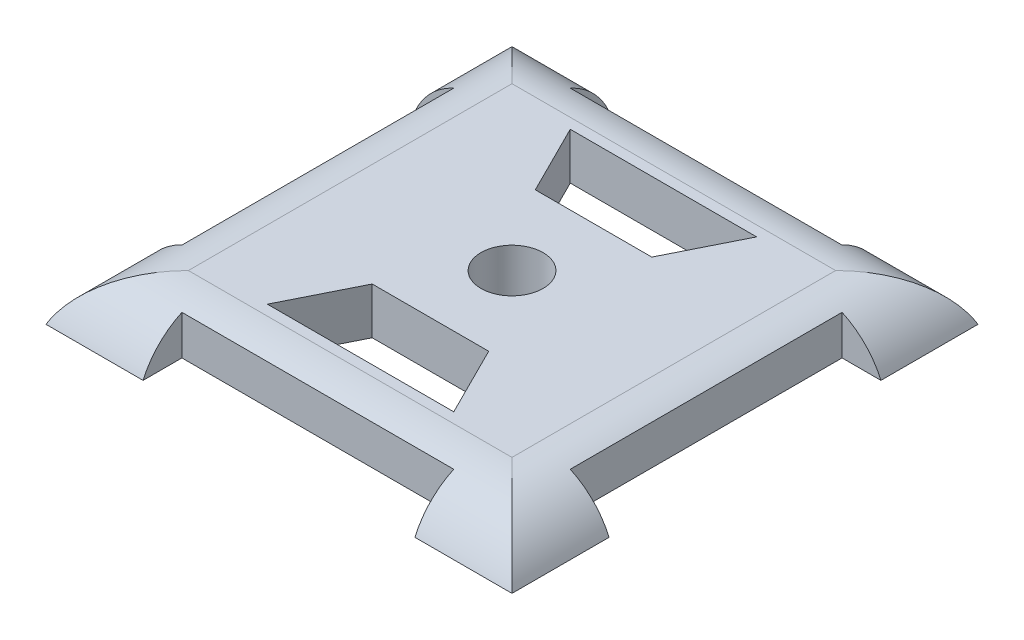
ISO-10303-21;
HEADER;
FILE_DESCRIPTION(('STEP AP214'),'2;1');
FILE_NAME('part.step','',(''),(''),'','','');
FILE_SCHEMA(('AUTOMOTIVE_DESIGN { 1 0 10303 214 1 1 1 1 }'));
ENDSEC;
DATA;
#1=APPLICATION_CONTEXT('core data for automotive mechanical design processes');
#2=APPLICATION_PROTOCOL_DEFINITION('international standard','automotive_design',2000,#1);
#3=PRODUCT_CONTEXT('',#1,'mechanical');
#4=PRODUCT('Part','Part','',(#3));
#5=PRODUCT_RELATED_PRODUCT_CATEGORY('part','',(#4));
#6=PRODUCT_DEFINITION_FORMATION('','',#4);
#7=PRODUCT_DEFINITION_CONTEXT('part definition',#1,'design');
#8=PRODUCT_DEFINITION('design','',#6,#7);
#9=PRODUCT_DEFINITION_SHAPE('','',#8);
#10=(LENGTH_UNIT() NAMED_UNIT(*) SI_UNIT(.MILLI.,.METRE.));
#11=(NAMED_UNIT(*) PLANE_ANGLE_UNIT() SI_UNIT($,.RADIAN.));
#12=(NAMED_UNIT(*) SI_UNIT($,.STERADIAN.) SOLID_ANGLE_UNIT());
#13=UNCERTAINTY_MEASURE_WITH_UNIT(LENGTH_MEASURE(1.E-05),#10,'distance_accuracy_value','');
#14=(GEOMETRIC_REPRESENTATION_CONTEXT(3) GLOBAL_UNCERTAINTY_ASSIGNED_CONTEXT((#13)) GLOBAL_UNIT_ASSIGNED_CONTEXT((#10,
#11,#12)) REPRESENTATION_CONTEXT('',''));
#15=CARTESIAN_POINT('',(0.,0.,0.));
#16=DIRECTION('',(0.,0.,1.));
#17=DIRECTION('',(1.,0.,0.));
#18=AXIS2_PLACEMENT_3D('',#15,#16,#17);
#19=CARTESIAN_POINT('',(-0.132653061224493,1.6,-1.19387755102041));
#20=DIRECTION('',(0.,1.,0.));
#21=DIRECTION('',(0.,0.,1.));
#22=AXIS2_PLACEMENT_3D('',#19,#20,#21);
#23=PLANE('',#22);
#24=CARTESIAN_POINT('',(-0.331632653061232,1.6,-2.98469387755102));
#25=DIRECTION('',(0.,-1.,0.));
#26=DIRECTION('',(0.,0.,-1.));
#27=AXIS2_PLACEMENT_3D('',#24,#25,#26);
#28=CIRCLE('',#27,0.8);
#29=CARTESIAN_POINT('',(-0.331632653061232,1.6,-3.78469387755102));
#30=VERTEX_POINT('',#29);
#31=EDGE_CURVE('E450',#30,#30,#28,.T.);
#32=ORIENTED_EDGE('',*,*,#31,.T.);
#33=EDGE_LOOP('',(#32));
#34=FACE_BOUND('',#33,.T.);
#35=DIRECTION('',(-1.,0.,0.));
#36=VECTOR('',#35,1.);
#37=CARTESIAN_POINT('',(5.66836734693877,1.6,1.18227584446664));
#38=LINE('',#37,#36);
#39=CARTESIAN_POINT('',(-4.4986023750789,1.6,1.18227584446664));
#40=VERTEX_POINT('',#39);
#41=CARTESIAN_POINT('',(3.83533706895643,1.6,1.18227584446664));
#42=VERTEX_POINT('',#41);
#43=EDGE_CURVE('E411',#40,#42,#38,.F.);
#44=ORIENTED_EDGE('',*,*,#43,.T.);
#45=DIRECTION('',(0.,0.,1.));
#46=VECTOR('',#45,1.);
#47=CARTESIAN_POINT('',(3.83533706895643,1.6,-8.98469387755102));
#48=LINE('',#47,#46);
#49=CARTESIAN_POINT('',(3.83533706895643,1.6,-7.15166359956868));
#50=VERTEX_POINT('',#49);
#51=EDGE_CURVE('E414',#42,#50,#48,.F.);
#52=ORIENTED_EDGE('',*,*,#51,.T.);
#53=DIRECTION('',(1.,0.,0.));
#54=VECTOR('',#53,1.);
#55=CARTESIAN_POINT('',(-6.33163265306123,1.6,-7.15166359956868));
#56=LINE('',#55,#54);
#57=CARTESIAN_POINT('',(-4.4986023750789,1.6,-7.15166359956868));
#58=VERTEX_POINT('',#57);
#59=EDGE_CURVE('E405',#50,#58,#56,.F.);
#60=ORIENTED_EDGE('',*,*,#59,.T.);
#61=DIRECTION('',(0.,0.,-1.));
#62=VECTOR('',#61,1.);
#63=CARTESIAN_POINT('',(-4.4986023750789,1.6,3.01530612244898));
#64=LINE('',#63,#62);
#65=EDGE_CURVE('E408',#58,#40,#64,.F.);
#66=ORIENTED_EDGE('',*,*,#65,.T.);
#67=EDGE_LOOP('',(#44,#52,#60,#66));
#68=FACE_BOUND('',#67,.T.);
#69=DIRECTION('',(0.447213595499958,0.,0.894427190999916));
#70=VECTOR('',#69,1.);
#71=CARTESIAN_POINT('',(-2.73163265306123,1.6,-6.88469387755102));
#72=LINE('',#71,#70);
#73=CARTESIAN_POINT('',(-2.73163265306123,1.6,-6.88469387755102));
#74=VERTEX_POINT('',#73);
#75=CARTESIAN_POINT('',(-1.83163265306123,1.6,-5.08469387755102));
#76=VERTEX_POINT('',#75);
#77=EDGE_CURVE('E325',#74,#76,#72,.T.);
#78=ORIENTED_EDGE('',*,*,#77,.F.);
#79=DIRECTION('',(-1.,0.,0.));
#80=VECTOR('',#79,1.);
#81=CARTESIAN_POINT('',(-2.73163265306123,1.6,-6.88469387755102));
#82=LINE('',#81,#80);
#83=CARTESIAN_POINT('',(2.06836734693877,1.6,-6.88469387755102));
#84=VERTEX_POINT('',#83);
#85=EDGE_CURVE('E312',#84,#74,#82,.T.);
#86=ORIENTED_EDGE('',*,*,#85,.F.);
#87=DIRECTION('',(0.447213595499958,0.,-0.894427190999916));
#88=VECTOR('',#87,1.);
#89=CARTESIAN_POINT('',(2.06836734693877,1.6,-6.88469387755102));
#90=LINE('',#89,#88);
#91=CARTESIAN_POINT('',(1.16836734693877,1.6,-5.08469387755102));
#92=VERTEX_POINT('',#91);
#93=EDGE_CURVE('E333',#92,#84,#90,.T.);
#94=ORIENTED_EDGE('',*,*,#93,.F.);
#95=DIRECTION('',(1.,0.,0.));
#96=VECTOR('',#95,1.);
#97=CARTESIAN_POINT('',(-1.83163265306123,1.6,-5.08469387755102));
#98=LINE('',#97,#96);
#99=EDGE_CURVE('E328',#76,#92,#98,.T.);
#100=ORIENTED_EDGE('',*,*,#99,.F.);
#101=EDGE_LOOP('',(#78,#86,#94,#100));
#102=FACE_BOUND('',#101,.T.);
#103=DIRECTION('',(1.,0.,0.));
#104=VECTOR('',#103,1.);
#105=CARTESIAN_POINT('',(-2.73163265306123,1.6,0.915306122448979));
#106=LINE('',#105,#104);
#107=CARTESIAN_POINT('',(-2.73163265306123,1.6,0.915306122448979));
#108=VERTEX_POINT('',#107);
#109=CARTESIAN_POINT('',(2.06836734693877,1.6,0.915306122448979));
#110=VERTEX_POINT('',#109);
#111=EDGE_CURVE('E250',#108,#110,#106,.T.);
#112=ORIENTED_EDGE('',*,*,#111,.F.);
#113=DIRECTION('',(-0.447213595499958,0.,0.894427190999916));
#114=VECTOR('',#113,1.);
#115=CARTESIAN_POINT('',(-2.73163265306123,1.6,0.915306122448979));
#116=LINE('',#115,#114);
#117=CARTESIAN_POINT('',(-1.83163265306123,1.6,-0.88469387755102));
#118=VERTEX_POINT('',#117);
#119=EDGE_CURVE('E358',#118,#108,#116,.T.);
#120=ORIENTED_EDGE('',*,*,#119,.F.);
#121=DIRECTION('',(-1.,0.,0.));
#122=VECTOR('',#121,1.);
#123=CARTESIAN_POINT('',(-1.83163265306123,1.6,-0.88469387755102));
#124=LINE('',#123,#122);
#125=CARTESIAN_POINT('',(1.16836734693877,1.6,-0.88469387755102));
#126=VERTEX_POINT('',#125);
#127=EDGE_CURVE('E377',#126,#118,#124,.T.);
#128=ORIENTED_EDGE('',*,*,#127,.F.);
#129=DIRECTION('',(-0.447213595499958,0.,-0.894427190999916));
#130=VECTOR('',#129,1.);
#131=CARTESIAN_POINT('',(2.06836734693877,1.6,0.915306122448979));
#132=LINE('',#131,#130);
#133=EDGE_CURVE('E373',#110,#126,#132,.T.);
#134=ORIENTED_EDGE('',*,*,#133,.F.);
#135=EDGE_LOOP('',(#112,#120,#128,#134));
#136=FACE_BOUND('',#135,.T.);
#137=ADVANCED_FACE('F39',(#34,#68,#102,#136),#23,.T.);
#138=CARTESIAN_POINT('',(-0.132653061224493,0.4,-1.19387755102041));
#139=DIRECTION('',(0.,1.,0.));
#140=DIRECTION('',(0.,0.,1.));
#141=AXIS2_PLACEMENT_3D('',#138,#139,#140);
#142=PLANE('',#141);
#143=CARTESIAN_POINT('',(-0.331632653061232,0.4,-2.98469387755102));
#144=DIRECTION('',(0.,-1.,0.));
#145=DIRECTION('',(0.,0.,-1.));
#146=AXIS2_PLACEMENT_3D('',#143,#144,#145);
#147=CIRCLE('',#146,0.8);
#148=CARTESIAN_POINT('',(-0.331632653061232,0.4,-3.78469387755102));
#149=VERTEX_POINT('',#148);
#150=EDGE_CURVE('E242',#149,#149,#147,.T.);
#151=ORIENTED_EDGE('',*,*,#150,.F.);
#152=EDGE_LOOP('',(#151));
#153=FACE_BOUND('',#152,.T.);
#154=DIRECTION('',(-1.,0.,0.));
#155=VECTOR('',#154,1.);
#156=CARTESIAN_POINT('',(-2.73163265306123,0.4,-6.88469387755102));
#157=LINE('',#156,#155);
#158=CARTESIAN_POINT('',(2.06836734693877,0.4,-6.88469387755102));
#159=VERTEX_POINT('',#158);
#160=CARTESIAN_POINT('',(-2.73163265306123,0.4,-6.88469387755102));
#161=VERTEX_POINT('',#160);
#162=EDGE_CURVE('E320',#159,#161,#157,.T.);
#163=ORIENTED_EDGE('',*,*,#162,.T.);
#164=DIRECTION('',(0.447213595499958,0.,0.894427190999916));
#165=VECTOR('',#164,1.);
#166=CARTESIAN_POINT('',(-2.73163265306123,0.4,-6.88469387755102));
#167=LINE('',#166,#165);
#168=CARTESIAN_POINT('',(-1.83163265306123,0.4,-5.08469387755102));
#169=VERTEX_POINT('',#168);
#170=EDGE_CURVE('E307',#161,#169,#167,.T.);
#171=ORIENTED_EDGE('',*,*,#170,.T.);
#172=DIRECTION('',(1.,0.,0.));
#173=VECTOR('',#172,1.);
#174=CARTESIAN_POINT('',(-1.83163265306123,0.4,-5.08469387755102));
#175=LINE('',#174,#173);
#176=CARTESIAN_POINT('',(1.16836734693877,0.4,-5.08469387755102));
#177=VERTEX_POINT('',#176);
#178=EDGE_CURVE('E311',#169,#177,#175,.T.);
#179=ORIENTED_EDGE('',*,*,#178,.T.);
#180=DIRECTION('',(0.447213595499958,0.,-0.894427190999916));
#181=VECTOR('',#180,1.);
#182=CARTESIAN_POINT('',(2.06836734693877,0.4,-6.88469387755102));
#183=LINE('',#182,#181);
#184=EDGE_CURVE('E316',#177,#159,#183,.T.);
#185=ORIENTED_EDGE('',*,*,#184,.T.);
#186=EDGE_LOOP('',(#163,#171,#179,#185));
#187=FACE_BOUND('',#186,.T.);
#188=DIRECTION('',(-0.447213595499958,0.,0.894427190999916));
#189=VECTOR('',#188,1.);
#190=CARTESIAN_POINT('',(-2.73163265306123,0.4,0.915306122448979));
#191=LINE('',#190,#189);
#192=CARTESIAN_POINT('',(-1.83163265306123,0.4,-0.88469387755102));
#193=VERTEX_POINT('',#192);
#194=CARTESIAN_POINT('',(-2.73163265306123,0.4,0.915306122448979));
#195=VERTEX_POINT('',#194);
#196=EDGE_CURVE('E366',#193,#195,#191,.T.);
#197=ORIENTED_EDGE('',*,*,#196,.T.);
#198=DIRECTION('',(1.,0.,0.));
#199=VECTOR('',#198,1.);
#200=CARTESIAN_POINT('',(-2.73163265306123,0.4,0.915306122448979));
#201=LINE('',#200,#199);
#202=CARTESIAN_POINT('',(2.06836734693877,0.4,0.915306122448979));
#203=VERTEX_POINT('',#202);
#204=EDGE_CURVE('E353',#195,#203,#201,.T.);
#205=ORIENTED_EDGE('',*,*,#204,.T.);
#206=DIRECTION('',(-0.447213595499958,0.,-0.894427190999916));
#207=VECTOR('',#206,1.);
#208=CARTESIAN_POINT('',(2.06836734693877,0.4,0.915306122448979));
#209=LINE('',#208,#207);
#210=CARTESIAN_POINT('',(1.16836734693877,0.4,-0.88469387755102));
#211=VERTEX_POINT('',#210);
#212=EDGE_CURVE('E357',#203,#211,#209,.T.);
#213=ORIENTED_EDGE('',*,*,#212,.T.);
#214=DIRECTION('',(-1.,0.,0.));
#215=VECTOR('',#214,1.);
#216=CARTESIAN_POINT('',(-1.83163265306123,0.4,-0.88469387755102));
#217=LINE('',#216,#215);
#218=EDGE_CURVE('E362',#211,#193,#217,.T.);
#219=ORIENTED_EDGE('',*,*,#218,.T.);
#220=EDGE_LOOP('',(#197,#205,#213,#219));
#221=FACE_BOUND('',#220,.T.);
#222=DIRECTION('',(-1.,0.,0.));
#223=VECTOR('',#222,1.);
#224=CARTESIAN_POINT('',(-3.83163265306123,0.4,2.01530612244898));
#225=LINE('',#224,#223);
#226=CARTESIAN_POINT('',(3.16836734693877,0.4,2.01530612244898));
#227=VERTEX_POINT('',#226);
#228=CARTESIAN_POINT('',(-3.83163265306123,0.4,2.01530612244898));
#229=VERTEX_POINT('',#228);
#230=EDGE_CURVE('E230',#227,#229,#225,.T.);
#231=ORIENTED_EDGE('',*,*,#230,.T.);
#232=DIRECTION('',(0.,0.,1.));
#233=VECTOR('',#232,1.);
#234=CARTESIAN_POINT('',(-3.83163265306123,0.4,3.01530612244898));
#235=LINE('',#234,#233);
#236=CARTESIAN_POINT('',(-3.83163265306123,0.4,3.01530612244898));
#237=VERTEX_POINT('',#236);
#238=EDGE_CURVE('E221',#229,#237,#235,.T.);
#239=ORIENTED_EDGE('',*,*,#238,.T.);
#240=DIRECTION('',(1.,0.,0.));
#241=VECTOR('',#240,1.);
#242=CARTESIAN_POINT('',(-6.33163265306123,0.4,3.01530612244898));
#243=LINE('',#242,#241);
#244=CARTESIAN_POINT('',(-6.33163265306123,0.4,3.01530612244898));
#245=VERTEX_POINT('',#244);
#246=EDGE_CURVE('E203',#245,#237,#243,.T.);
#247=ORIENTED_EDGE('',*,*,#246,.F.);
#248=DIRECTION('',(0.,0.,1.));
#249=VECTOR('',#248,1.);
#250=CARTESIAN_POINT('',(-6.33163265306123,0.4,-8.98469387755102));
#251=LINE('',#250,#249);
#252=CARTESIAN_POINT('',(-6.33163265306125,0.4,0.515306122448958));
#253=VERTEX_POINT('',#252);
#254=EDGE_CURVE('E343',#253,#245,#251,.T.);
#255=ORIENTED_EDGE('',*,*,#254,.F.);
#256=DIRECTION('',(1.,0.,0.));
#257=VECTOR('',#256,1.);
#258=CARTESIAN_POINT('',(-6.33163265306125,0.4,0.515306122448958));
#259=LINE('',#258,#257);
#260=CARTESIAN_POINT('',(-5.33163265306125,0.4,0.515306122448961));
#261=VERTEX_POINT('',#260);
#262=EDGE_CURVE('E258',#253,#261,#259,.T.);
#263=ORIENTED_EDGE('',*,*,#262,.T.);
#264=DIRECTION('',(0.,0.,-1.));
#265=VECTOR('',#264,1.);
#266=CARTESIAN_POINT('',(-5.33163265306122,0.4,-6.48469387755104));
#267=LINE('',#266,#265);
#268=CARTESIAN_POINT('',(-5.33163265306122,0.4,-6.48469387755104));
#269=VERTEX_POINT('',#268);
#270=EDGE_CURVE('E263',#261,#269,#267,.T.);
#271=ORIENTED_EDGE('',*,*,#270,.T.);
#272=DIRECTION('',(-1.,0.,0.));
#273=VECTOR('',#272,1.);
#274=CARTESIAN_POINT('',(-6.33163265306122,0.4,-6.48469387755104));
#275=LINE('',#274,#273);
#276=CARTESIAN_POINT('',(-6.33163265306122,0.4,-6.48469387755104));
#277=VERTEX_POINT('',#276);
#278=EDGE_CURVE('E254',#269,#277,#275,.T.);
#279=ORIENTED_EDGE('',*,*,#278,.T.);
#280=CARTESIAN_POINT('',(-6.33163265306123,0.4,-8.98469387755102));
#281=VERTEX_POINT('',#280);
#282=EDGE_CURVE('E395',#281,#277,#251,.T.);
#283=ORIENTED_EDGE('',*,*,#282,.F.);
#284=DIRECTION('',(-1.,0.,0.));
#285=VECTOR('',#284,1.);
#286=CARTESIAN_POINT('',(-6.33163265306123,0.4,-8.98469387755102));
#287=LINE('',#286,#285);
#288=CARTESIAN_POINT('',(-3.83163265306119,0.4,-8.98469387755105));
#289=VERTEX_POINT('',#288);
#290=EDGE_CURVE('E401',#289,#281,#287,.T.);
#291=ORIENTED_EDGE('',*,*,#290,.F.);
#292=DIRECTION('',(0.,0.,1.));
#293=VECTOR('',#292,1.);
#294=CARTESIAN_POINT('',(-3.83163265306119,0.4,-8.98469387755105));
#295=LINE('',#294,#293);
#296=CARTESIAN_POINT('',(-3.8316326530612,0.4,-7.98469387755105));
#297=VERTEX_POINT('',#296);
#298=EDGE_CURVE('E274',#289,#297,#295,.T.);
#299=ORIENTED_EDGE('',*,*,#298,.T.);
#300=DIRECTION('',(1.,0.,0.));
#301=VECTOR('',#300,1.);
#302=CARTESIAN_POINT('',(3.1683673469388,0.4,-7.984693877551));
#303=LINE('',#302,#301);
#304=CARTESIAN_POINT('',(3.1683673469388,0.4,-7.984693877551));
#305=VERTEX_POINT('',#304);
#306=EDGE_CURVE('E279',#297,#305,#303,.T.);
#307=ORIENTED_EDGE('',*,*,#306,.T.);
#308=DIRECTION('',(0.,0.,-1.));
#309=VECTOR('',#308,1.);
#310=CARTESIAN_POINT('',(3.16836734693881,0.4,-8.984693877551));
#311=LINE('',#310,#309);
#312=CARTESIAN_POINT('',(3.16836734693881,0.4,-8.984693877551));
#313=VERTEX_POINT('',#312);
#314=EDGE_CURVE('E270',#305,#313,#311,.T.);
#315=ORIENTED_EDGE('',*,*,#314,.T.);
#316=CARTESIAN_POINT('',(5.66836734693877,0.4,-8.98469387755102));
#317=VERTEX_POINT('',#316);
#318=EDGE_CURVE('E402',#317,#313,#287,.T.);
#319=ORIENTED_EDGE('',*,*,#318,.F.);
#320=DIRECTION('',(0.,0.,-1.));
#321=VECTOR('',#320,1.);
#322=CARTESIAN_POINT('',(5.66836734693877,0.4,-8.98469387755102));
#323=LINE('',#322,#321);
#324=CARTESIAN_POINT('',(5.66836734693881,0.4,-6.48469387755096));
#325=VERTEX_POINT('',#324);
#326=EDGE_CURVE('E214',#325,#317,#323,.T.);
#327=ORIENTED_EDGE('',*,*,#326,.F.);
#328=DIRECTION('',(-1.,0.,0.));
#329=VECTOR('',#328,1.);
#330=CARTESIAN_POINT('',(5.66836734693881,0.4,-6.48469387755096));
#331=LINE('',#330,#329);
#332=CARTESIAN_POINT('',(4.66836734693881,0.4,-6.48469387755097));
#333=VERTEX_POINT('',#332);
#334=EDGE_CURVE('E292',#325,#333,#331,.T.);
#335=ORIENTED_EDGE('',*,*,#334,.T.);
#336=DIRECTION('',(0.,0.,1.));
#337=VECTOR('',#336,1.);
#338=CARTESIAN_POINT('',(4.66836734693873,0.4,0.515306122449031));
#339=LINE('',#338,#337);
#340=CARTESIAN_POINT('',(4.66836734693873,0.4,0.515306122449031));
#341=VERTEX_POINT('',#340);
#342=EDGE_CURVE('E296',#333,#341,#339,.T.);
#343=ORIENTED_EDGE('',*,*,#342,.T.);
#344=DIRECTION('',(1.,0.,0.));
#345=VECTOR('',#344,1.);
#346=CARTESIAN_POINT('',(5.66836734693873,0.4,0.515306122449042));
#347=LINE('',#346,#345);
#348=CARTESIAN_POINT('',(5.66836734693873,0.4,0.515306122449042));
#349=VERTEX_POINT('',#348);
#350=EDGE_CURVE('E288',#341,#349,#347,.T.);
#351=ORIENTED_EDGE('',*,*,#350,.T.);
#352=CARTESIAN_POINT('',(5.66836734693877,0.4,3.01530612244898));
#353=VERTEX_POINT('',#352);
#354=EDGE_CURVE('E398',#353,#349,#323,.T.);
#355=ORIENTED_EDGE('',*,*,#354,.F.);
#356=CARTESIAN_POINT('',(3.16836734693877,0.4,3.01530612244898));
#357=VERTEX_POINT('',#356);
#358=EDGE_CURVE('E215',#357,#353,#243,.T.);
#359=ORIENTED_EDGE('',*,*,#358,.F.);
#360=DIRECTION('',(0.,0.,-1.));
#361=VECTOR('',#360,1.);
#362=CARTESIAN_POINT('',(3.16836734693877,0.4,3.01530612244898));
#363=LINE('',#362,#361);
#364=EDGE_CURVE('E232',#357,#227,#363,.T.);
#365=ORIENTED_EDGE('',*,*,#364,.T.);
#366=EDGE_LOOP('',(#231,#239,#247,#255,#263,#271,#279,#283,#291,#299,#307,#315,#319,#327,#335,
#343,#351,#355,#359,#365));
#367=FACE_BOUND('',#366,.T.);
#368=ADVANCED_FACE('F228',(#153,#187,#221,#367),#142,.F.);
#369=CARTESIAN_POINT('',(-2.73163265306123,0.4,0.915306122448979));
#370=DIRECTION('',(0.,0.,1.));
#371=DIRECTION('',(1.,0.,0.));
#372=AXIS2_PLACEMENT_3D('',#369,#370,#371);
#373=PLANE('',#372);
#374=ORIENTED_EDGE('',*,*,#111,.T.);
#375=DIRECTION('',(0.,1.,0.));
#376=VECTOR('',#375,1.);
#377=CARTESIAN_POINT('',(2.06836734693877,0.4,0.915306122448979));
#378=LINE('',#377,#376);
#379=EDGE_CURVE('E370',#203,#110,#378,.T.);
#380=ORIENTED_EDGE('',*,*,#379,.F.);
#381=ORIENTED_EDGE('',*,*,#204,.F.);
#382=DIRECTION('',(0.,1.,0.));
#383=VECTOR('',#382,1.);
#384=CARTESIAN_POINT('',(-2.73163265306123,0.4,0.915306122448979));
#385=LINE('',#384,#383);
#386=EDGE_CURVE('E329',#195,#108,#385,.T.);
#387=ORIENTED_EDGE('',*,*,#386,.T.);
#388=EDGE_LOOP('',(#374,#380,#381,#387));
#389=FACE_BOUND('',#388,.T.);
#390=ADVANCED_FACE('F514',(#389),#373,.F.);
#391=CARTESIAN_POINT('',(-2.73163265306123,0.4,0.915306122448979));
#392=DIRECTION('',(-0.894427190999916,0.,-0.447213595499958));
#393=DIRECTION('',(-0.447213595499958,0.,0.894427190999916));
#394=AXIS2_PLACEMENT_3D('',#391,#392,#393);
#395=PLANE('',#394);
#396=ORIENTED_EDGE('',*,*,#119,.T.);
#397=ORIENTED_EDGE('',*,*,#386,.F.);
#398=ORIENTED_EDGE('',*,*,#196,.F.);
#399=DIRECTION('',(0.,1.,0.));
#400=VECTOR('',#399,1.);
#401=CARTESIAN_POINT('',(-1.83163265306123,0.4,-0.88469387755102));
#402=LINE('',#401,#400);
#403=EDGE_CURVE('E386',#193,#118,#402,.T.);
#404=ORIENTED_EDGE('',*,*,#403,.T.);
#405=EDGE_LOOP('',(#396,#397,#398,#404));
#406=FACE_BOUND('',#405,.T.);
#407=ADVANCED_FACE('F620',(#406),#395,.F.);
#408=CARTESIAN_POINT('',(-1.83163265306123,0.4,-0.88469387755102));
#409=DIRECTION('',(0.,0.,-1.));
#410=DIRECTION('',(-1.,0.,0.));
#411=AXIS2_PLACEMENT_3D('',#408,#409,#410);
#412=PLANE('',#411);
#413=ORIENTED_EDGE('',*,*,#127,.T.);
#414=ORIENTED_EDGE('',*,*,#403,.F.);
#415=ORIENTED_EDGE('',*,*,#218,.F.);
#416=DIRECTION('',(0.,1.,0.));
#417=VECTOR('',#416,1.);
#418=CARTESIAN_POINT('',(1.16836734693877,0.4,-0.88469387755102));
#419=LINE('',#418,#417);
#420=EDGE_CURVE('E389',#211,#126,#419,.T.);
#421=ORIENTED_EDGE('',*,*,#420,.T.);
#422=EDGE_LOOP('',(#413,#414,#415,#421));
#423=FACE_BOUND('',#422,.T.);
#424=ADVANCED_FACE('F631',(#423),#412,.F.);
#425=CARTESIAN_POINT('',(2.06836734693877,0.4,0.915306122448979));
#426=DIRECTION('',(0.894427190999916,0.,-0.447213595499958));
#427=DIRECTION('',(-0.447213595499958,0.,-0.894427190999916));
#428=AXIS2_PLACEMENT_3D('',#425,#426,#427);
#429=PLANE('',#428);
#430=ORIENTED_EDGE('',*,*,#133,.T.);
#431=ORIENTED_EDGE('',*,*,#420,.F.);
#432=ORIENTED_EDGE('',*,*,#212,.F.);
#433=ORIENTED_EDGE('',*,*,#379,.T.);
#434=EDGE_LOOP('',(#430,#431,#432,#433));
#435=FACE_BOUND('',#434,.T.);
#436=ADVANCED_FACE('F628',(#435),#429,.F.);
#437=CARTESIAN_POINT('',(-2.73163265306123,0.4,-6.88469387755102));
#438=DIRECTION('',(-0.894427190999916,0.,0.447213595499958));
#439=DIRECTION('',(0.447213595499958,0.,0.894427190999916));
#440=AXIS2_PLACEMENT_3D('',#437,#438,#439);
#441=PLANE('',#440);
#442=ORIENTED_EDGE('',*,*,#77,.T.);
#443=DIRECTION('',(0.,1.,0.));
#444=VECTOR('',#443,1.);
#445=CARTESIAN_POINT('',(-1.83163265306123,0.4,-5.08469387755102));
#446=LINE('',#445,#444);
#447=EDGE_CURVE('E324',#169,#76,#446,.T.);
#448=ORIENTED_EDGE('',*,*,#447,.F.);
#449=ORIENTED_EDGE('',*,*,#170,.F.);
#450=DIRECTION('',(0.,1.,0.));
#451=VECTOR('',#450,1.);
#452=CARTESIAN_POINT('',(-2.73163265306123,0.4,-6.88469387755102));
#453=LINE('',#452,#451);
#454=EDGE_CURVE('E340',#161,#74,#453,.T.);
#455=ORIENTED_EDGE('',*,*,#454,.T.);
#456=EDGE_LOOP('',(#442,#448,#449,#455));
#457=FACE_BOUND('',#456,.T.);
#458=ADVANCED_FACE('F639',(#457),#441,.F.);
#459=CARTESIAN_POINT('',(-2.73163265306123,0.4,-6.88469387755102));
#460=DIRECTION('',(0.,0.,-1.));
#461=DIRECTION('',(-1.,0.,0.));
#462=AXIS2_PLACEMENT_3D('',#459,#460,#461);
#463=PLANE('',#462);
#464=ORIENTED_EDGE('',*,*,#85,.T.);
#465=ORIENTED_EDGE('',*,*,#454,.F.);
#466=ORIENTED_EDGE('',*,*,#162,.F.);
#467=DIRECTION('',(0.,1.,0.));
#468=VECTOR('',#467,1.);
#469=CARTESIAN_POINT('',(2.06836734693877,0.4,-6.88469387755102));
#470=LINE('',#469,#468);
#471=EDGE_CURVE('E344',#159,#84,#470,.T.);
#472=ORIENTED_EDGE('',*,*,#471,.T.);
#473=EDGE_LOOP('',(#464,#465,#466,#472));
#474=FACE_BOUND('',#473,.T.);
#475=ADVANCED_FACE('F644',(#474),#463,.F.);
#476=CARTESIAN_POINT('',(2.06836734693877,0.4,-6.88469387755102));
#477=DIRECTION('',(0.894427190999916,0.,0.447213595499958));
#478=DIRECTION('',(0.447213595499958,0.,-0.894427190999916));
#479=AXIS2_PLACEMENT_3D('',#476,#477,#478);
#480=PLANE('',#479);
#481=ORIENTED_EDGE('',*,*,#93,.T.);
#482=ORIENTED_EDGE('',*,*,#471,.F.);
#483=ORIENTED_EDGE('',*,*,#184,.F.);
#484=DIRECTION('',(0.,1.,0.));
#485=VECTOR('',#484,1.);
#486=CARTESIAN_POINT('',(1.16836734693877,0.4,-5.08469387755102));
#487=LINE('',#486,#485);
#488=EDGE_CURVE('E347',#177,#92,#487,.T.);
#489=ORIENTED_EDGE('',*,*,#488,.T.);
#490=EDGE_LOOP('',(#481,#482,#483,#489));
#491=FACE_BOUND('',#490,.T.);
#492=ADVANCED_FACE('F650',(#491),#480,.F.);
#493=CARTESIAN_POINT('',(-1.83163265306123,0.4,-5.08469387755102));
#494=DIRECTION('',(0.,0.,1.));
#495=DIRECTION('',(1.,0.,0.));
#496=AXIS2_PLACEMENT_3D('',#493,#494,#495);
#497=PLANE('',#496);
#498=ORIENTED_EDGE('',*,*,#99,.T.);
#499=ORIENTED_EDGE('',*,*,#488,.F.);
#500=ORIENTED_EDGE('',*,*,#178,.F.);
#501=ORIENTED_EDGE('',*,*,#447,.T.);
#502=EDGE_LOOP('',(#498,#499,#500,#501));
#503=FACE_BOUND('',#502,.T.);
#504=ADVANCED_FACE('F646',(#503),#497,.F.);
#505=CARTESIAN_POINT('',(5.66836734693873,0.4,0.515306122449042));
#506=DIRECTION('',(0.,0.,1.));
#507=DIRECTION('',(1.,0.,0.));
#508=AXIS2_PLACEMENT_3D('',#505,#506,#507);
#509=PLANE('',#508);
#510=DIRECTION('',(0.,1.,0.));
#511=VECTOR('',#510,1.);
#512=CARTESIAN_POINT('',(4.66836734693873,0.4,0.515306122449031));
#513=LINE('',#512,#511);
#514=CARTESIAN_POINT('',(4.66836734693873,1.41825756040357,0.51530612244903));
#515=VERTEX_POINT('',#514);
#516=EDGE_CURVE('E275',#341,#515,#513,.T.);
#517=ORIENTED_EDGE('',*,*,#516,.T.);
#518=CARTESIAN_POINT('',(3.83533706895643,-0.4,0.515306122449022));
#519=DIRECTION('',(0.,0.,1.));
#520=DIRECTION('',(1.,0.,0.));
#521=AXIS2_PLACEMENT_3D('',#518,#519,#520);
#522=CIRCLE('',#521,2.);
#523=EDGE_CURVE('E424',#515,#349,#522,.F.);
#524=ORIENTED_EDGE('',*,*,#523,.T.);
#525=ORIENTED_EDGE('',*,*,#350,.F.);
#526=EDGE_LOOP('',(#517,#524,#525));
#527=FACE_BOUND('',#526,.T.);
#528=ADVANCED_FACE('F649',(#527),#509,.F.);
#529=CARTESIAN_POINT('',(4.66836734693873,0.4,0.515306122449031));
#530=DIRECTION('',(-1.,0.,0.));
#531=DIRECTION('',(0.,0.,1.));
#532=AXIS2_PLACEMENT_3D('',#529,#530,#531);
#533=PLANE('',#532);
#534=DIRECTION('',(0.,1.,0.));
#535=VECTOR('',#534,1.);
#536=CARTESIAN_POINT('',(4.66836734693881,0.4,-6.48469387755097));
#537=LINE('',#536,#535);
#538=CARTESIAN_POINT('',(4.66836734693881,1.41825756040355,-6.48469387755097));
#539=VERTEX_POINT('',#538);
#540=EDGE_CURVE('E300',#333,#539,#537,.T.);
#541=ORIENTED_EDGE('',*,*,#540,.T.);
#542=DIRECTION('',(0.,0.,-1.));
#543=VECTOR('',#542,1.);
#544=CARTESIAN_POINT('',(4.66836734693881,1.41825756040353,-6.48469387755097));
#545=LINE('',#544,#543);
#546=EDGE_CURVE('E421',#539,#515,#545,.F.);
#547=ORIENTED_EDGE('',*,*,#546,.T.);
#548=ORIENTED_EDGE('',*,*,#516,.F.);
#549=ORIENTED_EDGE('',*,*,#342,.F.);
#550=EDGE_LOOP('',(#541,#547,#548,#549));
#551=FACE_BOUND('',#550,.T.);
#552=ADVANCED_FACE('F660',(#551),#533,.F.);
#553=CARTESIAN_POINT('',(5.66836734693881,0.4,-6.48469387755096));
#554=DIRECTION('',(0.,0.,-1.));
#555=DIRECTION('',(-1.,0.,0.));
#556=AXIS2_PLACEMENT_3D('',#553,#554,#555);
#557=PLANE('',#556);
#558=ORIENTED_EDGE('',*,*,#334,.F.);
#559=CARTESIAN_POINT('',(3.83533706895643,-0.4,-6.48469387755098));
#560=DIRECTION('',(0.,0.,-1.));
#561=DIRECTION('',(-1.,0.,0.));
#562=AXIS2_PLACEMENT_3D('',#559,#560,#561);
#563=CIRCLE('',#562,2.);
#564=EDGE_CURVE('E418',#325,#539,#563,.F.);
#565=ORIENTED_EDGE('',*,*,#564,.T.);
#566=ORIENTED_EDGE('',*,*,#540,.F.);
#567=EDGE_LOOP('',(#558,#565,#566));
#568=FACE_BOUND('',#567,.T.);
#569=ADVANCED_FACE('F662',(#568),#557,.F.);
#570=CARTESIAN_POINT('',(3.16836734693881,0.4,-8.984693877551));
#571=DIRECTION('',(1.,0.,0.));
#572=DIRECTION('',(0.,0.,-1.));
#573=AXIS2_PLACEMENT_3D('',#570,#571,#572);
#574=PLANE('',#573);
#575=DIRECTION('',(0.,1.,0.));
#576=VECTOR('',#575,1.);
#577=CARTESIAN_POINT('',(3.1683673469388,0.4,-7.984693877551));
#578=LINE('',#577,#576);
#579=CARTESIAN_POINT('',(3.1683673469388,1.41825756040356,-7.984693877551));
#580=VERTEX_POINT('',#579);
#581=EDGE_CURVE('E259',#305,#580,#578,.T.);
#582=ORIENTED_EDGE('',*,*,#581,.T.);
#583=CARTESIAN_POINT('',(3.1683673469388,-0.4,-7.15166359956868));
#584=DIRECTION('',(1.,0.,0.));
#585=DIRECTION('',(0.,0.,-1.));
#586=AXIS2_PLACEMENT_3D('',#583,#584,#585);
#587=CIRCLE('',#586,2.);
#588=EDGE_CURVE('E11',#580,#313,#587,.F.);
#589=ORIENTED_EDGE('',*,*,#588,.T.);
#590=ORIENTED_EDGE('',*,*,#314,.F.);
#591=EDGE_LOOP('',(#582,#589,#590));
#592=FACE_BOUND('',#591,.T.);
#593=ADVANCED_FACE('F496',(#592),#574,.F.);
#594=CARTESIAN_POINT('',(3.1683673469388,0.4,-7.984693877551));
#595=DIRECTION('',(0.,0.,1.));
#596=DIRECTION('',(1.,0.,0.));
#597=AXIS2_PLACEMENT_3D('',#594,#595,#596);
#598=PLANE('',#597);
#599=DIRECTION('',(0.,1.,0.));
#600=VECTOR('',#599,1.);
#601=CARTESIAN_POINT('',(-3.8316326530612,0.4,-7.98469387755105));
#602=LINE('',#601,#600);
#603=CARTESIAN_POINT('',(-3.8316326530612,1.41825756040355,-7.98469387755105));
#604=VERTEX_POINT('',#603);
#605=EDGE_CURVE('E283',#297,#604,#602,.T.);
#606=ORIENTED_EDGE('',*,*,#605,.T.);
#607=DIRECTION('',(-1.,0.,0.));
#608=VECTOR('',#607,1.);
#609=CARTESIAN_POINT('',(-3.8316326530612,1.41825756040354,-7.98469387755105));
#610=LINE('',#609,#608);
#611=EDGE_CURVE('E49',#604,#580,#610,.F.);
#612=ORIENTED_EDGE('',*,*,#611,.T.);
#613=ORIENTED_EDGE('',*,*,#581,.F.);
#614=ORIENTED_EDGE('',*,*,#306,.F.);
#615=EDGE_LOOP('',(#606,#612,#613,#614));
#616=FACE_BOUND('',#615,.T.);
#617=ADVANCED_FACE('F497',(#616),#598,.F.);
#618=CARTESIAN_POINT('',(-3.83163265306119,0.4,-8.98469387755105));
#619=DIRECTION('',(-1.,0.,0.));
#620=DIRECTION('',(0.,0.,1.));
#621=AXIS2_PLACEMENT_3D('',#618,#619,#620);
#622=PLANE('',#621);
#623=ORIENTED_EDGE('',*,*,#298,.F.);
#624=CARTESIAN_POINT('',(-3.8316326530612,-0.4,-7.15166359956868));
#625=DIRECTION('',(-1.,0.,0.));
#626=DIRECTION('',(0.,0.,1.));
#627=AXIS2_PLACEMENT_3D('',#624,#625,#626);
#628=CIRCLE('',#627,2.);
#629=EDGE_CURVE('E64',#289,#604,#628,.F.);
#630=ORIENTED_EDGE('',*,*,#629,.T.);
#631=ORIENTED_EDGE('',*,*,#605,.F.);
#632=EDGE_LOOP('',(#623,#630,#631));
#633=FACE_BOUND('',#632,.T.);
#634=ADVANCED_FACE('F498',(#633),#622,.F.);
#635=CARTESIAN_POINT('',(-6.33163265306122,0.4,-6.48469387755104));
#636=DIRECTION('',(0.,0.,-1.));
#637=DIRECTION('',(-1.,0.,0.));
#638=AXIS2_PLACEMENT_3D('',#635,#636,#637);
#639=PLANE('',#638);
#640=DIRECTION('',(0.,1.,0.));
#641=VECTOR('',#640,1.);
#642=CARTESIAN_POINT('',(-5.33163265306122,0.4,-6.48469387755104));
#643=LINE('',#642,#641);
#644=CARTESIAN_POINT('',(-5.33163265306122,1.41825756040356,-6.48469387755104));
#645=VERTEX_POINT('',#644);
#646=EDGE_CURVE('E233',#269,#645,#643,.T.);
#647=ORIENTED_EDGE('',*,*,#646,.T.);
#648=CARTESIAN_POINT('',(-4.4986023750789,-0.4,-6.48469387755104));
#649=DIRECTION('',(0.,0.,-1.));
#650=DIRECTION('',(-1.,0.,0.));
#651=AXIS2_PLACEMENT_3D('',#648,#649,#650);
#652=CIRCLE('',#651,2.);
#653=EDGE_CURVE('E438',#645,#277,#652,.F.);
#654=ORIENTED_EDGE('',*,*,#653,.T.);
#655=ORIENTED_EDGE('',*,*,#278,.F.);
#656=EDGE_LOOP('',(#647,#654,#655));
#657=FACE_BOUND('',#656,.T.);
#658=ADVANCED_FACE('F478',(#657),#639,.F.);
#659=CARTESIAN_POINT('',(-5.33163265306122,0.4,-6.48469387755104));
#660=DIRECTION('',(1.,0.,0.));
#661=DIRECTION('',(0.,0.,-1.));
#662=AXIS2_PLACEMENT_3D('',#659,#660,#661);
#663=PLANE('',#662);
#664=DIRECTION('',(0.,1.,0.));
#665=VECTOR('',#664,1.);
#666=CARTESIAN_POINT('',(-5.33163265306125,0.4,0.515306122448961));
#667=LINE('',#666,#665);
#668=CARTESIAN_POINT('',(-5.33163265306125,1.41825756040355,0.515306122448961));
#669=VERTEX_POINT('',#668);
#670=EDGE_CURVE('E239',#261,#669,#667,.T.);
#671=ORIENTED_EDGE('',*,*,#670,.T.);
#672=DIRECTION('',(0.,0.,1.));
#673=VECTOR('',#672,1.);
#674=CARTESIAN_POINT('',(-5.33163265306125,1.41825756040354,0.515306122448961));
#675=LINE('',#674,#673);
#676=EDGE_CURVE('E435',#669,#645,#675,.F.);
#677=ORIENTED_EDGE('',*,*,#676,.T.);
#678=ORIENTED_EDGE('',*,*,#646,.F.);
#679=ORIENTED_EDGE('',*,*,#270,.F.);
#680=EDGE_LOOP('',(#671,#677,#678,#679));
#681=FACE_BOUND('',#680,.T.);
#682=ADVANCED_FACE('F481',(#681),#663,.F.);
#683=CARTESIAN_POINT('',(-6.33163265306125,0.4,0.515306122448958));
#684=DIRECTION('',(0.,0.,1.));
#685=DIRECTION('',(1.,0.,0.));
#686=AXIS2_PLACEMENT_3D('',#683,#684,#685);
#687=PLANE('',#686);
#688=ORIENTED_EDGE('',*,*,#262,.F.);
#689=CARTESIAN_POINT('',(-4.4986023750789,-0.4,0.515306122448964));
#690=DIRECTION('',(0.,0.,1.));
#691=DIRECTION('',(1.,0.,0.));
#692=AXIS2_PLACEMENT_3D('',#689,#690,#691);
#693=CIRCLE('',#692,2.);
#694=EDGE_CURVE('E225',#253,#669,#693,.F.);
#695=ORIENTED_EDGE('',*,*,#694,.T.);
#696=ORIENTED_EDGE('',*,*,#670,.F.);
#697=EDGE_LOOP('',(#688,#695,#696));
#698=FACE_BOUND('',#697,.T.);
#699=ADVANCED_FACE('F483',(#698),#687,.F.);
#700=CARTESIAN_POINT('',(-3.83163265306123,0.4,3.01530612244898));
#701=DIRECTION('',(-1.,0.,0.));
#702=DIRECTION('',(0.,0.,1.));
#703=AXIS2_PLACEMENT_3D('',#700,#701,#702);
#704=PLANE('',#703);
#705=DIRECTION('',(0.,1.,0.));
#706=VECTOR('',#705,1.);
#707=CARTESIAN_POINT('',(-3.83163265306123,0.4,2.01530612244898));
#708=LINE('',#707,#706);
#709=CARTESIAN_POINT('',(-3.83163265306123,1.41825756040355,2.01530612244898));
#710=VERTEX_POINT('',#709);
#711=EDGE_CURVE('E223',#229,#710,#708,.T.);
#712=ORIENTED_EDGE('',*,*,#711,.T.);
#713=CARTESIAN_POINT('',(-3.83163265306123,-0.4,1.18227584446664));
#714=DIRECTION('',(-1.,0.,0.));
#715=DIRECTION('',(0.,0.,1.));
#716=AXIS2_PLACEMENT_3D('',#713,#714,#715);
#717=CIRCLE('',#716,2.);
#718=EDGE_CURVE('E206',#710,#237,#717,.F.);
#719=ORIENTED_EDGE('',*,*,#718,.T.);
#720=ORIENTED_EDGE('',*,*,#238,.F.);
#721=EDGE_LOOP('',(#712,#719,#720));
#722=FACE_BOUND('',#721,.T.);
#723=ADVANCED_FACE('F220',(#722),#704,.F.);
#724=CARTESIAN_POINT('',(-3.83163265306123,0.4,2.01530612244898));
#725=DIRECTION('',(0.,0.,-1.));
#726=DIRECTION('',(-1.,0.,0.));
#727=AXIS2_PLACEMENT_3D('',#724,#725,#726);
#728=PLANE('',#727);
#729=DIRECTION('',(0.,1.,0.));
#730=VECTOR('',#729,1.);
#731=CARTESIAN_POINT('',(3.16836734693877,0.4,2.01530612244898));
#732=LINE('',#731,#730);
#733=CARTESIAN_POINT('',(3.16836734693877,1.41825756040355,2.01530612244898));
#734=VERTEX_POINT('',#733);
#735=EDGE_CURVE('E247',#227,#734,#732,.T.);
#736=ORIENTED_EDGE('',*,*,#735,.T.);
#737=DIRECTION('',(1.,0.,0.));
#738=VECTOR('',#737,1.);
#739=CARTESIAN_POINT('',(3.16836734693877,1.41825756040355,2.01530612244898));
#740=LINE('',#739,#738);
#741=EDGE_CURVE('E226',#734,#710,#740,.F.);
#742=ORIENTED_EDGE('',*,*,#741,.T.);
#743=ORIENTED_EDGE('',*,*,#711,.F.);
#744=ORIENTED_EDGE('',*,*,#230,.F.);
#745=EDGE_LOOP('',(#736,#742,#743,#744));
#746=FACE_BOUND('',#745,.T.);
#747=ADVANCED_FACE('F533',(#746),#728,.F.);
#748=CARTESIAN_POINT('',(3.16836734693877,0.4,3.01530612244898));
#749=DIRECTION('',(1.,0.,0.));
#750=DIRECTION('',(0.,0.,-1.));
#751=AXIS2_PLACEMENT_3D('',#748,#749,#750);
#752=PLANE('',#751);
#753=ORIENTED_EDGE('',*,*,#364,.F.);
#754=CARTESIAN_POINT('',(3.16836734693877,-0.4,1.18227584446664));
#755=DIRECTION('',(1.,0.,0.));
#756=DIRECTION('',(0.,0.,-1.));
#757=AXIS2_PLACEMENT_3D('',#754,#755,#756);
#758=CIRCLE('',#757,2.);
#759=EDGE_CURVE('E428',#357,#734,#758,.F.);
#760=ORIENTED_EDGE('',*,*,#759,.T.);
#761=ORIENTED_EDGE('',*,*,#735,.F.);
#762=EDGE_LOOP('',(#753,#760,#761));
#763=FACE_BOUND('',#762,.T.);
#764=ADVANCED_FACE('F529',(#763),#752,.F.);
#765=CARTESIAN_POINT('',(-6.33163265306123,-0.4,1.18227584446664));
#766=DIRECTION('',(1.,0.,0.));
#767=DIRECTION('',(0.,0.,-1.));
#768=AXIS2_PLACEMENT_3D('',#765,#766,#767);
#769=CYLINDRICAL_SURFACE('',#768,2.);
#770=CARTESIAN_POINT('',(-4.4986023750789,-0.4,1.18227584446664));
#771=DIRECTION('',(0.707106781186548,0.,0.707106781186547));
#772=DIRECTION('',(-0.707106781186547,0.,0.707106781186548));
#773=AXIS2_PLACEMENT_3D('',#770,#771,#772);
#774=ELLIPSE('',#773,2.82842712474619,2.);
#775=EDGE_CURVE('E43',#245,#40,#774,.F.);
#776=ORIENTED_EDGE('',*,*,#775,.F.);
#777=ORIENTED_EDGE('',*,*,#246,.T.);
#778=ORIENTED_EDGE('',*,*,#718,.F.);
#779=ORIENTED_EDGE('',*,*,#741,.F.);
#780=ORIENTED_EDGE('',*,*,#759,.F.);
#781=ORIENTED_EDGE('',*,*,#358,.T.);
#782=CARTESIAN_POINT('',(3.83533706895643,-0.4,1.18227584446664));
#783=DIRECTION('',(0.707106781186547,0.,-0.707106781186547));
#784=DIRECTION('',(0.707106781186547,0.,0.707106781186547));
#785=AXIS2_PLACEMENT_3D('',#782,#783,#784);
#786=ELLIPSE('',#785,2.82842712474619,2.);
#787=EDGE_CURVE('E453',#42,#353,#786,.T.);
#788=ORIENTED_EDGE('',*,*,#787,.F.);
#789=ORIENTED_EDGE('',*,*,#43,.F.);
#790=EDGE_LOOP('',(#776,#777,#778,#779,#780,#781,#788,#789));
#791=FACE_BOUND('',#790,.T.);
#792=ADVANCED_FACE('F41',(#791),#769,.T.);
#793=CARTESIAN_POINT('',(-4.4986023750789,-0.4,-8.98469387755102));
#794=DIRECTION('',(0.,0.,1.));
#795=DIRECTION('',(1.,0.,0.));
#796=AXIS2_PLACEMENT_3D('',#793,#794,#795);
#797=CYLINDRICAL_SURFACE('',#796,2.);
#798=ORIENTED_EDGE('',*,*,#775,.T.);
#799=ORIENTED_EDGE('',*,*,#65,.F.);
#800=CARTESIAN_POINT('',(-4.4986023750789,-0.4,-7.15166359956868));
#801=DIRECTION('',(-0.707106781186547,0.,0.707106781186548));
#802=DIRECTION('',(0.707106781186548,0.,0.707106781186547));
#803=AXIS2_PLACEMENT_3D('',#800,#801,#802);
#804=ELLIPSE('',#803,2.82842712474619,2.);
#805=EDGE_CURVE('E449',#281,#58,#804,.F.);
#806=ORIENTED_EDGE('',*,*,#805,.F.);
#807=ORIENTED_EDGE('',*,*,#282,.T.);
#808=ORIENTED_EDGE('',*,*,#653,.F.);
#809=ORIENTED_EDGE('',*,*,#676,.F.);
#810=ORIENTED_EDGE('',*,*,#694,.F.);
#811=ORIENTED_EDGE('',*,*,#254,.T.);
#812=EDGE_LOOP('',(#798,#799,#806,#807,#808,#809,#810,#811));
#813=FACE_BOUND('',#812,.T.);
#814=ADVANCED_FACE('F462',(#813),#797,.T.);
#815=CARTESIAN_POINT('',(3.83533706895643,-0.4,-8.98469387755102));
#816=DIRECTION('',(0.,0.,-1.));
#817=DIRECTION('',(-1.,0.,0.));
#818=AXIS2_PLACEMENT_3D('',#815,#816,#817);
#819=CYLINDRICAL_SURFACE('',#818,2.);
#820=ORIENTED_EDGE('',*,*,#787,.T.);
#821=ORIENTED_EDGE('',*,*,#354,.T.);
#822=ORIENTED_EDGE('',*,*,#523,.F.);
#823=ORIENTED_EDGE('',*,*,#546,.F.);
#824=ORIENTED_EDGE('',*,*,#564,.F.);
#825=ORIENTED_EDGE('',*,*,#326,.T.);
#826=CARTESIAN_POINT('',(3.83533706895643,-0.4,-7.15166359956868));
#827=DIRECTION('',(-0.707106781186547,0.,-0.707106781186547));
#828=DIRECTION('',(0.707106781186547,0.,-0.707106781186547));
#829=AXIS2_PLACEMENT_3D('',#826,#827,#828);
#830=ELLIPSE('',#829,2.82842712474619,2.);
#831=EDGE_CURVE('E446',#50,#317,#830,.T.);
#832=ORIENTED_EDGE('',*,*,#831,.F.);
#833=ORIENTED_EDGE('',*,*,#51,.F.);
#834=EDGE_LOOP('',(#820,#821,#822,#823,#824,#825,#832,#833));
#835=FACE_BOUND('',#834,.T.);
#836=ADVANCED_FACE('F491',(#835),#819,.T.);
#837=CARTESIAN_POINT('',(-6.33163265306123,-0.4,-7.15166359956868));
#838=DIRECTION('',(-1.,0.,0.));
#839=DIRECTION('',(0.,0.,1.));
#840=AXIS2_PLACEMENT_3D('',#837,#838,#839);
#841=CYLINDRICAL_SURFACE('',#840,2.);
#842=ORIENTED_EDGE('',*,*,#805,.T.);
#843=ORIENTED_EDGE('',*,*,#59,.F.);
#844=ORIENTED_EDGE('',*,*,#831,.T.);
#845=ORIENTED_EDGE('',*,*,#318,.T.);
#846=ORIENTED_EDGE('',*,*,#588,.F.);
#847=ORIENTED_EDGE('',*,*,#611,.F.);
#848=ORIENTED_EDGE('',*,*,#629,.F.);
#849=ORIENTED_EDGE('',*,*,#290,.T.);
#850=EDGE_LOOP('',(#842,#843,#844,#845,#846,#847,#848,#849));
#851=FACE_BOUND('',#850,.T.);
#852=ADVANCED_FACE('F470',(#851),#841,.T.);
#853=CARTESIAN_POINT('',(-0.331632653061232,1.6,-2.98469387755102));
#854=DIRECTION('',(0.,-1.,0.));
#855=DIRECTION('',(0.,0.,-1.));
#856=AXIS2_PLACEMENT_3D('',#853,#854,#855);
#857=CYLINDRICAL_SURFACE('',#856,0.8);
#858=ORIENTED_EDGE('',*,*,#31,.F.);
#859=EDGE_LOOP('',(#858));
#860=FACE_BOUND('',#859,.T.);
#861=ORIENTED_EDGE('',*,*,#150,.T.);
#862=EDGE_LOOP('',(#861));
#863=FACE_BOUND('',#862,.T.);
#864=ADVANCED_FACE('F523',(#860,#863),#857,.F.);
#865=CLOSED_SHELL('',(#137,#368,#390,#407,#424,#436,#458,#475,#492,#504,#528,#552,#569,#593,
#617,#634,#658,#682,#699,#723,#747,#764,#792,#814,#836,#852,#864));
#866=MANIFOLD_SOLID_BREP('B2',#865);
#867=ADVANCED_BREP_SHAPE_REPRESENTATION('',(#18,#866),#14);
#868=SHAPE_DEFINITION_REPRESENTATION(#9,#867);
ENDSEC;
END-ISO-10303-21;
